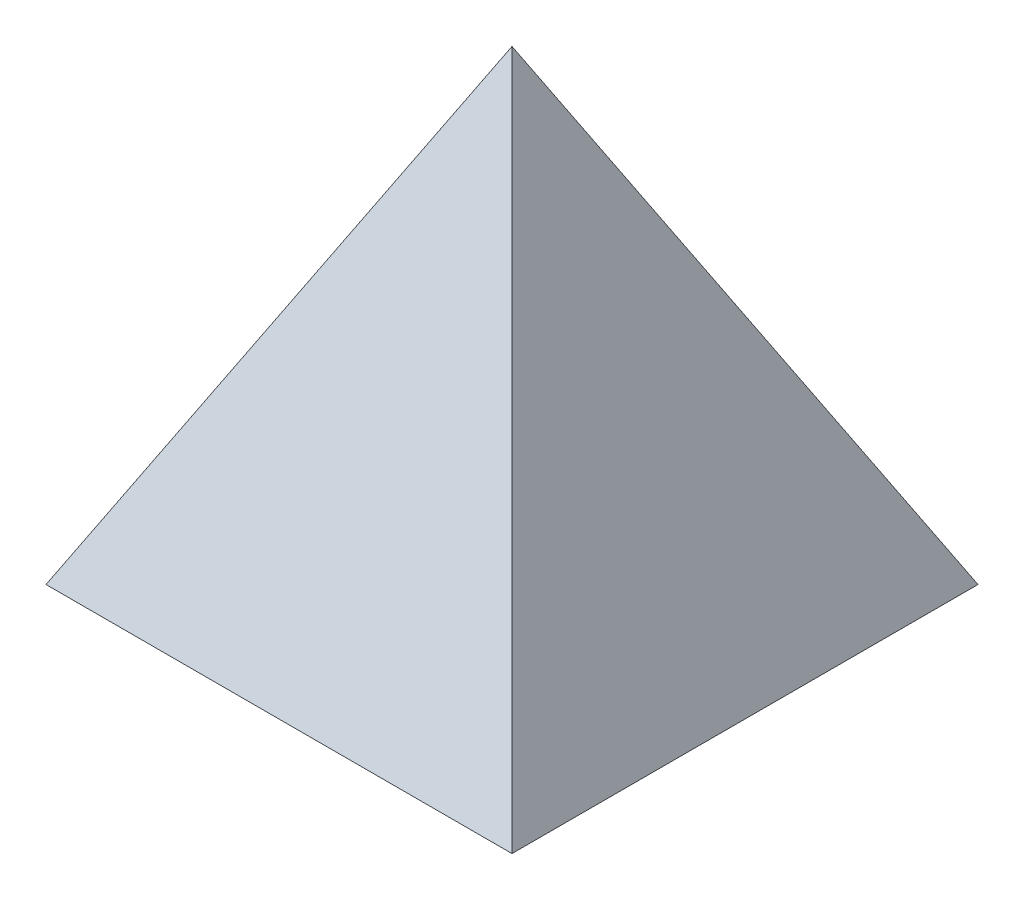
ISO-10303-21;
HEADER;
FILE_DESCRIPTION(('STEP AP214'),'2;1');
FILE_NAME('part.step','',(''),(''),'','','');
FILE_SCHEMA(('AUTOMOTIVE_DESIGN { 1 0 10303 214 1 1 1 1 }'));
ENDSEC;
DATA;
#1=APPLICATION_CONTEXT('core data for automotive mechanical design processes');
#2=APPLICATION_PROTOCOL_DEFINITION('international standard','automotive_design',2000,#1);
#3=PRODUCT_CONTEXT('',#1,'mechanical');
#4=PRODUCT('Part','Part','',(#3));
#5=PRODUCT_RELATED_PRODUCT_CATEGORY('part','',(#4));
#6=PRODUCT_DEFINITION_FORMATION('','',#4);
#7=PRODUCT_DEFINITION_CONTEXT('part definition',#1,'design');
#8=PRODUCT_DEFINITION('design','',#6,#7);
#9=PRODUCT_DEFINITION_SHAPE('','',#8);
#10=(LENGTH_UNIT() NAMED_UNIT(*) SI_UNIT(.MILLI.,.METRE.));
#11=(NAMED_UNIT(*) PLANE_ANGLE_UNIT() SI_UNIT($,.RADIAN.));
#12=(NAMED_UNIT(*) SI_UNIT($,.STERADIAN.) SOLID_ANGLE_UNIT());
#13=UNCERTAINTY_MEASURE_WITH_UNIT(LENGTH_MEASURE(1.E-05),#10,'distance_accuracy_value','');
#14=(GEOMETRIC_REPRESENTATION_CONTEXT(3) GLOBAL_UNCERTAINTY_ASSIGNED_CONTEXT((#13)) GLOBAL_UNIT_ASSIGNED_CONTEXT((#10,
#11,#12)) REPRESENTATION_CONTEXT('',''));
#15=CARTESIAN_POINT('',(0.,0.,0.));
#16=DIRECTION('',(0.,0.,1.));
#17=DIRECTION('',(1.,0.,0.));
#18=AXIS2_PLACEMENT_3D('',#15,#16,#17);
#19=CARTESIAN_POINT('',(0.,0.,0.));
#20=DIRECTION('',(0.,-1.,0.));
#21=DIRECTION('',(0.,0.,-1.));
#22=AXIS2_PLACEMENT_3D('',#19,#20,#21);
#23=PLANE('',#22);
#24=DIRECTION('',(0.,0.,1.));
#25=VECTOR('',#24,1.);
#26=CARTESIAN_POINT('',(0.,0.,0.));
#27=LINE('',#26,#25);
#28=CARTESIAN_POINT('',(0.,0.,-0.6));
#29=VERTEX_POINT('',#28);
#30=CARTESIAN_POINT('',(0.,0.,0.));
#31=VERTEX_POINT('',#30);
#32=EDGE_CURVE('E88',#29,#31,#27,.T.);
#33=ORIENTED_EDGE('',*,*,#32,.F.);
#34=DIRECTION('',(-1.,0.,0.));
#35=VECTOR('',#34,1.);
#36=CARTESIAN_POINT('',(0.,0.,-0.6));
#37=LINE('',#36,#35);
#38=CARTESIAN_POINT('',(0.6,0.,-0.6));
#39=VERTEX_POINT('',#38);
#40=EDGE_CURVE('E58',#39,#29,#37,.T.);
#41=ORIENTED_EDGE('',*,*,#40,.F.);
#42=DIRECTION('',(0.,0.,-1.));
#43=VECTOR('',#42,1.);
#44=CARTESIAN_POINT('',(0.6,0.,0.));
#45=LINE('',#44,#43);
#46=CARTESIAN_POINT('',(0.6,0.,0.));
#47=VERTEX_POINT('',#46);
#48=EDGE_CURVE('E94',#47,#39,#45,.T.);
#49=ORIENTED_EDGE('',*,*,#48,.F.);
#50=DIRECTION('',(1.,0.,0.));
#51=VECTOR('',#50,1.);
#52=CARTESIAN_POINT('',(0.,0.,0.));
#53=LINE('',#52,#51);
#54=EDGE_CURVE('E65',#31,#47,#53,.T.);
#55=ORIENTED_EDGE('',*,*,#54,.F.);
#56=EDGE_LOOP('',(#33,#41,#49,#55));
#57=FACE_BOUND('',#56,.T.);
#58=ADVANCED_FACE('F51',(#57),#23,.T.);
#59=CARTESIAN_POINT('',(0.,0.,-0.6));
#60=DIRECTION('',(-0.894427190999916,0.447213595499958,0.));
#61=DIRECTION('',(-0.447213595499958,-0.894427190999916,0.));
#62=AXIS2_PLACEMENT_3D('',#59,#60,#61);
#63=PLANE('',#62);
#64=DIRECTION('',(-0.408248290463863,-0.816496580927726,0.408248290463863));
#65=VECTOR('',#64,1.);
#66=CARTESIAN_POINT('',(0.1,0.2,-0.0999999999999998));
#67=LINE('',#66,#65);
#68=CARTESIAN_POINT('',(0.3,0.6,-0.3));
#69=VERTEX_POINT('',#68);
#70=EDGE_CURVE('E79',#69,#31,#67,.T.);
#71=ORIENTED_EDGE('',*,*,#70,.F.);
#72=DIRECTION('',(0.408248290463863,0.816496580927726,0.408248290463863));
#73=VECTOR('',#72,1.);
#74=CARTESIAN_POINT('',(0.,0.,-0.6));
#75=LINE('',#74,#73);
#76=EDGE_CURVE('E85',#29,#69,#75,.T.);
#77=ORIENTED_EDGE('',*,*,#76,.F.);
#78=ORIENTED_EDGE('',*,*,#32,.T.);
#79=EDGE_LOOP('',(#71,#77,#78));
#80=FACE_BOUND('',#79,.T.);
#81=ADVANCED_FACE('F89',(#80),#63,.T.);
#82=CARTESIAN_POINT('',(0.48,0.24,-0.6));
#83=DIRECTION('',(0.894427190999916,0.447213595499958,0.));
#84=DIRECTION('',(-0.447213595499958,0.894427190999916,0.));
#85=AXIS2_PLACEMENT_3D('',#82,#83,#84);
#86=PLANE('',#85);
#87=DIRECTION('',(-0.408248290463863,0.816496580927726,-0.408248290463863));
#88=VECTOR('',#87,1.);
#89=CARTESIAN_POINT('',(0.4,0.4,-0.2));
#90=LINE('',#89,#88);
#91=EDGE_CURVE('E82',#47,#69,#90,.T.);
#92=ORIENTED_EDGE('',*,*,#91,.F.);
#93=ORIENTED_EDGE('',*,*,#48,.T.);
#94=DIRECTION('',(0.408248290463863,-0.816496580927726,-0.408248290463863));
#95=VECTOR('',#94,1.);
#96=CARTESIAN_POINT('',(0.5,0.2,-0.5));
#97=LINE('',#96,#95);
#98=EDGE_CURVE('E12',#69,#39,#97,.T.);
#99=ORIENTED_EDGE('',*,*,#98,.F.);
#100=EDGE_LOOP('',(#92,#93,#99));
#101=FACE_BOUND('',#100,.T.);
#102=ADVANCED_FACE('F100',(#101),#86,.T.);
#103=CARTESIAN_POINT('',(0.6,0.24,-0.48));
#104=DIRECTION('',(0.,-0.447213595499958,0.894427190999916));
#105=DIRECTION('',(0.,-0.894427190999916,-0.447213595499958));
#106=AXIS2_PLACEMENT_3D('',#103,#104,#105);
#107=PLANE('',#106);
#108=ORIENTED_EDGE('',*,*,#76,.T.);
#109=ORIENTED_EDGE('',*,*,#98,.T.);
#110=ORIENTED_EDGE('',*,*,#40,.T.);
#111=EDGE_LOOP('',(#108,#109,#110));
#112=FACE_BOUND('',#111,.T.);
#113=ADVANCED_FACE('F98',(#112),#107,.F.);
#114=CARTESIAN_POINT('',(0.6,0.,0.));
#115=DIRECTION('',(0.,-0.447213595499958,-0.894427190999916));
#116=DIRECTION('',(0.,0.894427190999916,-0.447213595499958));
#117=AXIS2_PLACEMENT_3D('',#114,#115,#116);
#118=PLANE('',#117);
#119=ORIENTED_EDGE('',*,*,#70,.T.);
#120=ORIENTED_EDGE('',*,*,#54,.T.);
#121=ORIENTED_EDGE('',*,*,#91,.T.);
#122=EDGE_LOOP('',(#119,#120,#121));
#123=FACE_BOUND('',#122,.T.);
#124=ADVANCED_FACE('F81',(#123),#118,.F.);
#125=CLOSED_SHELL('',(#58,#81,#102,#113,#124));
#126=MANIFOLD_SOLID_BREP('B2',#125);
#127=ADVANCED_BREP_SHAPE_REPRESENTATION('',(#18,#126),#14);
#128=SHAPE_DEFINITION_REPRESENTATION(#9,#127);
ENDSEC;
END-ISO-10303-21;
